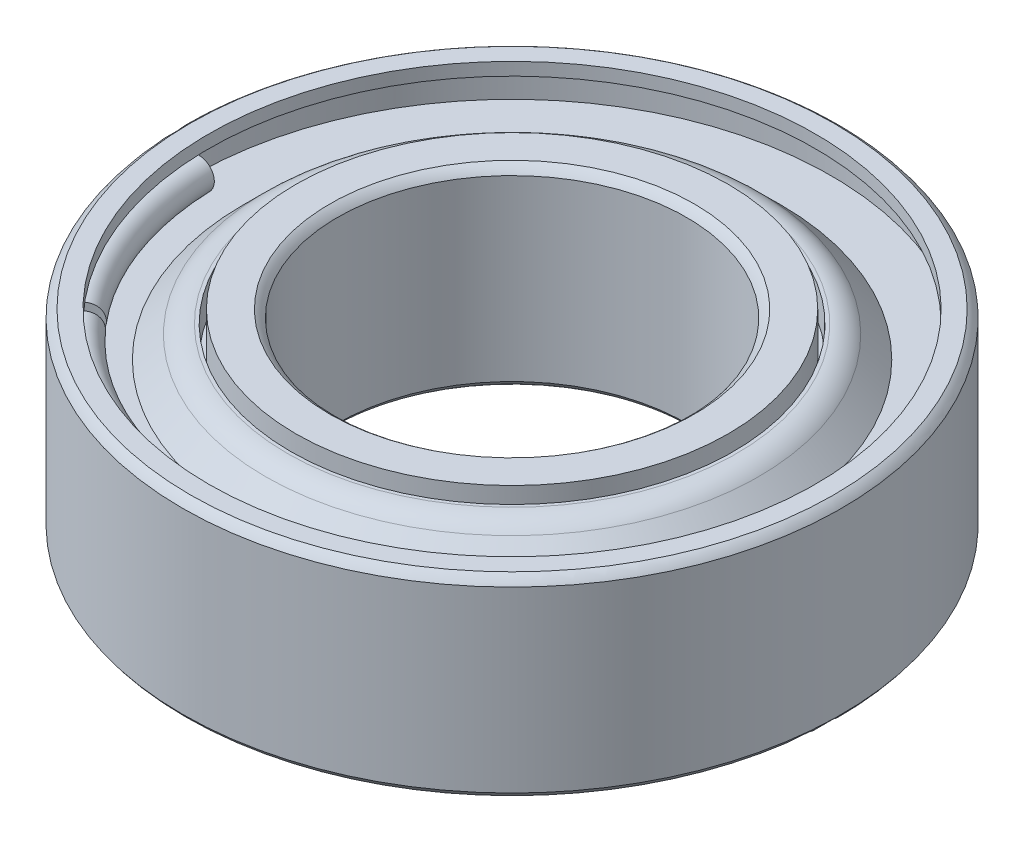
ISO-10303-21;
HEADER;
FILE_DESCRIPTION(('STEP AP214'),'2;1');
FILE_NAME('part.step','',(''),(''),'','','');
FILE_SCHEMA(('AUTOMOTIVE_DESIGN { 1 0 10303 214 1 1 1 1 }'));
ENDSEC;
DATA;
#1=APPLICATION_CONTEXT('core data for automotive mechanical design processes');
#2=APPLICATION_PROTOCOL_DEFINITION('international standard','automotive_design',2000,#1);
#3=PRODUCT_CONTEXT('',#1,'mechanical');
#4=PRODUCT('Part','Part','',(#3));
#5=PRODUCT_RELATED_PRODUCT_CATEGORY('part','',(#4));
#6=PRODUCT_DEFINITION_FORMATION('','',#4);
#7=PRODUCT_DEFINITION_CONTEXT('part definition',#1,'design');
#8=PRODUCT_DEFINITION('design','',#6,#7);
#9=PRODUCT_DEFINITION_SHAPE('','',#8);
#10=(LENGTH_UNIT() NAMED_UNIT(*) SI_UNIT(.MILLI.,.METRE.));
#11=(NAMED_UNIT(*) PLANE_ANGLE_UNIT() SI_UNIT($,.RADIAN.));
#12=(NAMED_UNIT(*) SI_UNIT($,.STERADIAN.) SOLID_ANGLE_UNIT());
#13=UNCERTAINTY_MEASURE_WITH_UNIT(LENGTH_MEASURE(1.E-05),#10,'distance_accuracy_value','');
#14=(GEOMETRIC_REPRESENTATION_CONTEXT(3) GLOBAL_UNCERTAINTY_ASSIGNED_CONTEXT((#13)) GLOBAL_UNIT_ASSIGNED_CONTEXT((#10,
#11,#12)) REPRESENTATION_CONTEXT('',''));
#15=CARTESIAN_POINT('',(0.,0.,0.));
#16=DIRECTION('',(0.,0.,1.));
#17=DIRECTION('',(1.,0.,0.));
#18=AXIS2_PLACEMENT_3D('',#15,#16,#17);
#19=CARTESIAN_POINT('',(0.,1.1302,0.));
#20=DIRECTION('',(0.,-1.,0.));
#21=DIRECTION('',(0.,0.,1.));
#22=AXIS2_PLACEMENT_3D('',#19,#20,#21);
#23=PLANE('',#22);
#24=CARTESIAN_POINT('',(0.,1.1302,0.));
#25=DIRECTION('',(0.,1.,0.));
#26=DIRECTION('',(0.,0.,1.));
#27=AXIS2_PLACEMENT_3D('',#24,#25,#26);
#28=CIRCLE('',#27,5.575);
#29=CARTESIAN_POINT('',(0.,1.1302,5.575));
#30=VERTEX_POINT('',#29);
#31=EDGE_CURVE('P0_E44',#30,#30,#28,.T.);
#32=ORIENTED_EDGE('',*,*,#31,.T.);
#33=EDGE_LOOP('',(#32));
#34=FACE_BOUND('',#33,.T.);
#35=CARTESIAN_POINT('',(0.,1.1302,0.));
#36=DIRECTION('',(0.,1.,0.));
#37=DIRECTION('',(0.,0.,1.));
#38=AXIS2_PLACEMENT_3D('',#35,#36,#37);
#39=CIRCLE('',#38,5.707692409183);
#40=CARTESIAN_POINT('',(0.,1.1302,5.707692409183));
#41=VERTEX_POINT('',#40);
#42=EDGE_CURVE('P0_E103',#41,#41,#39,.T.);
#43=ORIENTED_EDGE('',*,*,#42,.F.);
#44=EDGE_LOOP('',(#43));
#45=FACE_BOUND('',#44,.T.);
#46=ADVANCED_FACE('P0_F23',(#34,#45),#23,.T.);
#47=CARTESIAN_POINT('',(0.,3.8698,0.));
#48=DIRECTION('',(0.,1.,0.));
#49=DIRECTION('',(0.,0.,1.));
#50=AXIS2_PLACEMENT_3D('',#47,#48,#49);
#51=PLANE('',#50);
#52=CARTESIAN_POINT('',(0.,3.8698,0.));
#53=DIRECTION('',(0.,1.,0.));
#54=DIRECTION('',(0.,0.,1.));
#55=AXIS2_PLACEMENT_3D('',#52,#53,#54);
#56=CIRCLE('',#55,5.707692409183);
#57=CARTESIAN_POINT('',(0.,3.8698,5.707692409183));
#58=VERTEX_POINT('',#57);
#59=EDGE_CURVE('P0_E66',#58,#58,#56,.T.);
#60=ORIENTED_EDGE('',*,*,#59,.T.);
#61=EDGE_LOOP('',(#60));
#62=FACE_BOUND('',#61,.T.);
#63=CARTESIAN_POINT('',(0.,3.8698,0.));
#64=DIRECTION('',(0.,1.,0.));
#65=DIRECTION('',(0.,0.,1.));
#66=AXIS2_PLACEMENT_3D('',#63,#64,#65);
#67=CIRCLE('',#66,5.575);
#68=CARTESIAN_POINT('',(0.,3.8698,5.575));
#69=VERTEX_POINT('',#68);
#70=EDGE_CURVE('P0_E67',#69,#69,#67,.T.);
#71=ORIENTED_EDGE('',*,*,#70,.F.);
#72=EDGE_LOOP('',(#71));
#73=FACE_BOUND('',#72,.T.);
#74=ADVANCED_FACE('P0_F174',(#62,#73),#51,.T.);
#75=CARTESIAN_POINT('',(0.,1.1302,0.));
#76=DIRECTION('',(0.,1.,0.));
#77=DIRECTION('',(0.,0.,1.));
#78=AXIS2_PLACEMENT_3D('',#75,#76,#77);
#79=CIRCLE('',#78,6.925);
#80=CARTESIAN_POINT('',(0.,1.1302,6.925));
#81=VERTEX_POINT('',#80);
#82=EDGE_CURVE('P0_E124',#81,#81,#79,.T.);
#83=ORIENTED_EDGE('',*,*,#82,.T.);
#84=EDGE_LOOP('',(#83));
#85=FACE_BOUND('',#84,.T.);
#86=CARTESIAN_POINT('',(0.,1.1302,0.));
#87=DIRECTION('',(0.,1.,0.));
#88=DIRECTION('',(0.,0.,1.));
#89=AXIS2_PLACEMENT_3D('',#86,#87,#88);
#90=CIRCLE('',#89,8.225);
#91=CARTESIAN_POINT('',(0.,1.1302,8.225));
#92=VERTEX_POINT('',#91);
#93=EDGE_CURVE('P0_E54',#92,#92,#90,.T.);
#94=ORIENTED_EDGE('',*,*,#93,.F.);
#95=EDGE_LOOP('',(#94));
#96=FACE_BOUND('',#95,.T.);
#97=ADVANCED_FACE('P0_F176',(#85,#96),#23,.T.);
#98=CARTESIAN_POINT('',(0.,0.3302,0.));
#99=DIRECTION('',(0.,-1.,0.));
#100=DIRECTION('',(0.,0.,-1.));
#101=AXIS2_PLACEMENT_3D('',#98,#99,#100);
#102=PLANE('',#101);
#103=CARTESIAN_POINT('',(0.,0.3302,0.));
#104=DIRECTION('',(0.,1.,0.));
#105=DIRECTION('',(0.,0.,-1.));
#106=AXIS2_PLACEMENT_3D('',#103,#104,#105);
#107=CIRCLE('',#106,7.825);
#108=CARTESIAN_POINT('',(0.,0.3302,-7.825));
#109=VERTEX_POINT('',#108);
#110=EDGE_CURVE('P0_E55',#109,#109,#107,.T.);
#111=ORIENTED_EDGE('',*,*,#110,.F.);
#112=EDGE_LOOP('',(#111));
#113=FACE_BOUND('',#112,.T.);
#114=CARTESIAN_POINT('',(0.,0.3302,0.));
#115=DIRECTION('',(0.,1.,0.));
#116=DIRECTION('',(0.,0.,-1.));
#117=AXIS2_PLACEMENT_3D('',#114,#115,#116);
#118=CIRCLE('',#117,8.225);
#119=CARTESIAN_POINT('',(0.,0.3302,-8.225));
#120=VERTEX_POINT('',#119);
#121=EDGE_CURVE('P0_E50',#120,#120,#118,.T.);
#122=ORIENTED_EDGE('',*,*,#121,.T.);
#123=EDGE_LOOP('',(#122));
#124=FACE_BOUND('',#123,.T.);
#125=ADVANCED_FACE('P0_F186',(#113,#124),#102,.F.);
#126=CARTESIAN_POINT('',(0.,3.8698,0.));
#127=DIRECTION('',(0.,1.,0.));
#128=DIRECTION('',(0.,0.,1.));
#129=AXIS2_PLACEMENT_3D('',#126,#127,#128);
#130=CIRCLE('',#129,8.225);
#131=CARTESIAN_POINT('',(0.,3.8698,8.225));
#132=VERTEX_POINT('',#131);
#133=EDGE_CURVE('P0_E45',#132,#132,#130,.T.);
#134=ORIENTED_EDGE('',*,*,#133,.T.);
#135=EDGE_LOOP('',(#134));
#136=FACE_BOUND('',#135,.T.);
#137=CARTESIAN_POINT('',(0.,3.8698,0.));
#138=DIRECTION('',(0.,1.,0.));
#139=DIRECTION('',(0.,0.,1.));
#140=AXIS2_PLACEMENT_3D('',#137,#138,#139);
#141=CIRCLE('',#140,6.925);
#142=CARTESIAN_POINT('',(0.,3.8698,6.925));
#143=VERTEX_POINT('',#142);
#144=EDGE_CURVE('P0_E115',#143,#143,#141,.T.);
#145=ORIENTED_EDGE('',*,*,#144,.F.);
#146=EDGE_LOOP('',(#145));
#147=FACE_BOUND('',#146,.T.);
#148=ADVANCED_FACE('P0_F182',(#136,#147),#51,.T.);
#149=CARTESIAN_POINT('',(0.,4.6698,0.));
#150=DIRECTION('',(0.,1.,0.));
#151=DIRECTION('',(0.,0.,1.));
#152=AXIS2_PLACEMENT_3D('',#149,#150,#151);
#153=PLANE('',#152);
#154=CARTESIAN_POINT('',(0.,4.6698,0.));
#155=DIRECTION('',(0.,-1.,0.));
#156=DIRECTION('',(0.,0.,1.));
#157=AXIS2_PLACEMENT_3D('',#154,#155,#156);
#158=CIRCLE('',#157,7.825);
#159=CARTESIAN_POINT('',(0.,4.6698,7.825));
#160=VERTEX_POINT('',#159);
#161=EDGE_CURVE('P0_E32',#160,#160,#158,.T.);
#162=ORIENTED_EDGE('',*,*,#161,.F.);
#163=EDGE_LOOP('',(#162));
#164=FACE_BOUND('',#163,.T.);
#165=CARTESIAN_POINT('',(0.,4.6698,0.));
#166=DIRECTION('',(0.,1.,0.));
#167=DIRECTION('',(0.,0.,1.));
#168=AXIS2_PLACEMENT_3D('',#165,#166,#167);
#169=CIRCLE('',#168,8.225);
#170=CARTESIAN_POINT('',(0.,4.6698,8.225));
#171=VERTEX_POINT('',#170);
#172=EDGE_CURVE('P0_E41',#171,#171,#169,.T.);
#173=ORIENTED_EDGE('',*,*,#172,.F.);
#174=EDGE_LOOP('',(#173));
#175=FACE_BOUND('',#174,.T.);
#176=ADVANCED_FACE('P0_F478',(#164,#175),#153,.F.);
#177=CARTESIAN_POINT('',(0.,4.6698,0.));
#178=DIRECTION('',(0.,1.,0.));
#179=DIRECTION('',(0.,0.,1.));
#180=AXIS2_PLACEMENT_3D('',#177,#178,#179);
#181=CIRCLE('',#180,5.79362915010153);
#182=CARTESIAN_POINT('',(0.,4.6698,5.79362915010153));
#183=VERTEX_POINT('',#182);
#184=EDGE_CURVE('P0_E111',#183,#183,#181,.T.);
#185=ORIENTED_EDGE('',*,*,#184,.T.);
#186=EDGE_LOOP('',(#185));
#187=FACE_BOUND('',#186,.T.);
#188=CARTESIAN_POINT('',(0.,4.6698,0.));
#189=DIRECTION('',(0.,1.,0.));
#190=DIRECTION('',(0.,0.,1.));
#191=AXIS2_PLACEMENT_3D('',#188,#189,#190);
#192=CIRCLE('',#191,5.707692409183);
#193=CARTESIAN_POINT('',(0.,4.6698,5.707692409183));
#194=VERTEX_POINT('',#193);
#195=EDGE_CURVE('P0_E61',#194,#194,#192,.T.);
#196=ORIENTED_EDGE('',*,*,#195,.F.);
#197=EDGE_LOOP('',(#196));
#198=FACE_BOUND('',#197,.T.);
#199=ADVANCED_FACE('P0_F468',(#187,#198),#153,.T.);
#200=CARTESIAN_POINT('',(0.,0.3302,0.));
#201=DIRECTION('',(0.,1.,0.));
#202=DIRECTION('',(0.,0.,1.));
#203=AXIS2_PLACEMENT_3D('',#200,#201,#202);
#204=CIRCLE('',#203,5.707692409183);
#205=CARTESIAN_POINT('',(0.,0.3302,5.707692409183));
#206=VERTEX_POINT('',#205);
#207=EDGE_CURVE('P0_E74',#206,#206,#204,.T.);
#208=ORIENTED_EDGE('',*,*,#207,.T.);
#209=EDGE_LOOP('',(#208));
#210=FACE_BOUND('',#209,.T.);
#211=CARTESIAN_POINT('',(0.,0.3302,0.));
#212=DIRECTION('',(0.,-1.,0.));
#213=DIRECTION('',(0.,0.,-1.));
#214=AXIS2_PLACEMENT_3D('',#211,#212,#213);
#215=CIRCLE('',#214,5.79362915010152);
#216=CARTESIAN_POINT('',(0.,0.3302,-5.79362915010152));
#217=VERTEX_POINT('',#216);
#218=EDGE_CURVE('P0_E120',#217,#217,#215,.T.);
#219=ORIENTED_EDGE('',*,*,#218,.T.);
#220=EDGE_LOOP('',(#219));
#221=FACE_BOUND('',#220,.T.);
#222=ADVANCED_FACE('P0_F193',(#210,#221),#102,.T.);
#223=CARTESIAN_POINT('',(0.,5.,0.));
#224=DIRECTION('',(0.,1.,0.));
#225=DIRECTION('',(0.,0.,1.));
#226=AXIS2_PLACEMENT_3D('',#223,#224,#225);
#227=PLANE('',#226);
#228=CARTESIAN_POINT('',(0.,5.,0.));
#229=DIRECTION('',(0.,1.,0.));
#230=DIRECTION('',(0.,0.,1.));
#231=AXIS2_PLACEMENT_3D('',#228,#229,#230);
#232=CIRCLE('',#231,8.3);
#233=CARTESIAN_POINT('',(0.,5.,8.3));
#234=VERTEX_POINT('',#233);
#235=EDGE_CURVE('P0_E107',#234,#234,#232,.T.);
#236=ORIENTED_EDGE('',*,*,#235,.T.);
#237=EDGE_LOOP('',(#236));
#238=FACE_BOUND('',#237,.T.);
#239=CARTESIAN_POINT('',(0.,5.,0.));
#240=DIRECTION('',(0.,1.,0.));
#241=DIRECTION('',(0.,0.,1.));
#242=AXIS2_PLACEMENT_3D('',#239,#240,#241);
#243=CIRCLE('',#242,7.825);
#244=CARTESIAN_POINT('',(0.,5.,7.825));
#245=VERTEX_POINT('',#244);
#246=EDGE_CURVE('P0_E12',#245,#245,#243,.T.);
#247=ORIENTED_EDGE('',*,*,#246,.F.);
#248=EDGE_LOOP('',(#247));
#249=FACE_BOUND('',#248,.T.);
#250=ADVANCED_FACE('P0_F248',(#238,#249),#227,.T.);
#251=CARTESIAN_POINT('',(0.,0.,0.));
#252=DIRECTION('',(0.,1.,0.));
#253=DIRECTION('',(0.,0.,1.));
#254=AXIS2_PLACEMENT_3D('',#251,#252,#253);
#255=PLANE('',#254);
#256=CARTESIAN_POINT('',(0.,0.,0.));
#257=DIRECTION('',(0.,1.,0.));
#258=DIRECTION('',(0.,0.,1.));
#259=AXIS2_PLACEMENT_3D('',#256,#257,#258);
#260=CIRCLE('',#259,8.3);
#261=CARTESIAN_POINT('',(0.,0.,8.3));
#262=VERTEX_POINT('',#261);
#263=EDGE_CURVE('P0_E92',#262,#262,#260,.T.);
#264=ORIENTED_EDGE('',*,*,#263,.F.);
#265=EDGE_LOOP('',(#264));
#266=FACE_BOUND('',#265,.T.);
#267=CARTESIAN_POINT('',(0.,0.,0.));
#268=DIRECTION('',(0.,-1.,0.));
#269=DIRECTION('',(0.,0.,-1.));
#270=AXIS2_PLACEMENT_3D('',#267,#268,#269);
#271=CIRCLE('',#270,7.825);
#272=CARTESIAN_POINT('',(0.,0.,-7.825));
#273=VERTEX_POINT('',#272);
#274=EDGE_CURVE('P0_E59',#273,#273,#271,.T.);
#275=ORIENTED_EDGE('',*,*,#274,.F.);
#276=EDGE_LOOP('',(#275));
#277=FACE_BOUND('',#276,.T.);
#278=ADVANCED_FACE('P0_F239',(#266,#277),#255,.F.);
#279=CARTESIAN_POINT('',(0.,5.,0.));
#280=DIRECTION('',(0.,1.,0.));
#281=DIRECTION('',(0.,0.,1.));
#282=AXIS2_PLACEMENT_3D('',#279,#280,#281);
#283=CIRCLE('',#282,4.7);
#284=CARTESIAN_POINT('',(0.,5.,4.7));
#285=VERTEX_POINT('',#284);
#286=EDGE_CURVE('P0_E79',#285,#285,#283,.T.);
#287=ORIENTED_EDGE('',*,*,#286,.F.);
#288=EDGE_LOOP('',(#287));
#289=FACE_BOUND('',#288,.T.);
#290=CARTESIAN_POINT('',(0.,5.,0.));
#291=DIRECTION('',(0.,1.,0.));
#292=DIRECTION('',(0.,0.,1.));
#293=AXIS2_PLACEMENT_3D('',#290,#291,#292);
#294=CIRCLE('',#293,5.575);
#295=CARTESIAN_POINT('',(0.,5.,5.575));
#296=VERTEX_POINT('',#295);
#297=EDGE_CURVE('P0_E27',#296,#296,#294,.T.);
#298=ORIENTED_EDGE('',*,*,#297,.T.);
#299=EDGE_LOOP('',(#298));
#300=FACE_BOUND('',#299,.T.);
#301=ADVANCED_FACE('P0_F236',(#289,#300),#227,.T.);
#302=CARTESIAN_POINT('',(0.,0.,0.));
#303=DIRECTION('',(0.,1.,0.));
#304=DIRECTION('',(0.,0.,1.));
#305=AXIS2_PLACEMENT_3D('',#302,#303,#304);
#306=CIRCLE('',#305,4.7);
#307=CARTESIAN_POINT('',(0.,0.,4.7));
#308=VERTEX_POINT('',#307);
#309=EDGE_CURVE('P0_E80',#308,#308,#306,.T.);
#310=ORIENTED_EDGE('',*,*,#309,.T.);
#311=EDGE_LOOP('',(#310));
#312=FACE_BOUND('',#311,.T.);
#313=CARTESIAN_POINT('',(0.,0.,0.));
#314=DIRECTION('',(0.,-1.,0.));
#315=DIRECTION('',(0.,0.,-1.));
#316=AXIS2_PLACEMENT_3D('',#313,#314,#315);
#317=CIRCLE('',#316,5.575);
#318=CARTESIAN_POINT('',(0.,0.,-5.575));
#319=VERTEX_POINT('',#318);
#320=EDGE_CURVE('P0_E60',#319,#319,#317,.T.);
#321=ORIENTED_EDGE('',*,*,#320,.T.);
#322=EDGE_LOOP('',(#321));
#323=FACE_BOUND('',#322,.T.);
#324=ADVANCED_FACE('P0_F233',(#312,#323),#255,.F.);
#325=CARTESIAN_POINT('',(0.,0.,0.));
#326=DIRECTION('',(0.,1.,0.));
#327=DIRECTION('',(0.,0.,1.));
#328=AXIS2_PLACEMENT_3D('',#325,#326,#327);
#329=CYLINDRICAL_SURFACE('',#328,4.5);
#330=CARTESIAN_POINT('',(0.,4.8,0.));
#331=DIRECTION('',(0.,1.,0.));
#332=DIRECTION('',(0.,0.,1.));
#333=AXIS2_PLACEMENT_3D('',#330,#331,#332);
#334=CIRCLE('',#333,4.5);
#335=CARTESIAN_POINT('',(0.,4.8,4.5));
#336=VERTEX_POINT('',#335);
#337=EDGE_CURVE('P0_E84',#336,#336,#334,.T.);
#338=ORIENTED_EDGE('',*,*,#337,.T.);
#339=EDGE_LOOP('',(#338));
#340=FACE_BOUND('',#339,.T.);
#341=CARTESIAN_POINT('',(0.,0.200000000000003,0.));
#342=DIRECTION('',(0.,1.,0.));
#343=DIRECTION('',(0.,0.,1.));
#344=AXIS2_PLACEMENT_3D('',#341,#342,#343);
#345=CIRCLE('',#344,4.5);
#346=CARTESIAN_POINT('',(0.,0.200000000000003,4.5));
#347=VERTEX_POINT('',#346);
#348=EDGE_CURVE('P0_E75',#347,#347,#345,.T.);
#349=ORIENTED_EDGE('',*,*,#348,.F.);
#350=EDGE_LOOP('',(#349));
#351=FACE_BOUND('',#350,.T.);
#352=ADVANCED_FACE('P0_F235',(#340,#351),#329,.F.);
#353=CARTESIAN_POINT('',(0.,5.,0.));
#354=DIRECTION('',(0.,-1.,0.));
#355=DIRECTION('',(0.,0.,-1.));
#356=AXIS2_PLACEMENT_3D('',#353,#354,#355);
#357=CYLINDRICAL_SURFACE('',#356,8.5);
#358=CARTESIAN_POINT('',(0.,0.200000000000003,0.));
#359=DIRECTION('',(0.,1.,0.));
#360=DIRECTION('',(0.,0.,1.));
#361=AXIS2_PLACEMENT_3D('',#358,#359,#360);
#362=CIRCLE('',#361,8.5);
#363=CARTESIAN_POINT('',(0.,0.200000000000003,8.5));
#364=VERTEX_POINT('',#363);
#365=EDGE_CURVE('P0_E88',#364,#364,#362,.T.);
#366=ORIENTED_EDGE('',*,*,#365,.T.);
#367=EDGE_LOOP('',(#366));
#368=FACE_BOUND('',#367,.T.);
#369=CARTESIAN_POINT('',(0.,4.8,0.));
#370=DIRECTION('',(0.,1.,0.));
#371=DIRECTION('',(0.,0.,1.));
#372=AXIS2_PLACEMENT_3D('',#369,#370,#371);
#373=CIRCLE('',#372,8.5);
#374=CARTESIAN_POINT('',(0.,4.8,8.5));
#375=VERTEX_POINT('',#374);
#376=EDGE_CURVE('P0_E96',#375,#375,#373,.T.);
#377=ORIENTED_EDGE('',*,*,#376,.F.);
#378=EDGE_LOOP('',(#377));
#379=FACE_BOUND('',#378,.T.);
#380=ADVANCED_FACE('P0_F222',(#368,#379),#357,.T.);
#381=CARTESIAN_POINT('',(0.,0.3302,0.));
#382=DIRECTION('',(0.,-1.,0.));
#383=DIRECTION('',(0.,0.,-1.));
#384=AXIS2_PLACEMENT_3D('',#381,#382,#383);
#385=CYLINDRICAL_SURFACE('',#384,7.825);
#386=ORIENTED_EDGE('',*,*,#246,.T.);
#387=EDGE_LOOP('',(#386));
#388=FACE_BOUND('',#387,.T.);
#389=ORIENTED_EDGE('',*,*,#161,.T.);
#390=EDGE_LOOP('',(#389));
#391=FACE_BOUND('',#390,.T.);
#392=ADVANCED_FACE('P0_F25',(#388,#391),#385,.F.);
#393=CARTESIAN_POINT('',(0.,0.3302,0.));
#394=DIRECTION('',(0.,-1.,0.));
#395=DIRECTION('',(0.,0.,-1.));
#396=AXIS2_PLACEMENT_3D('',#393,#394,#395);
#397=CYLINDRICAL_SURFACE('',#396,5.575);
#398=ORIENTED_EDGE('',*,*,#297,.F.);
#399=EDGE_LOOP('',(#398));
#400=FACE_BOUND('',#399,.T.);
#401=ORIENTED_EDGE('',*,*,#70,.T.);
#402=EDGE_LOOP('',(#401));
#403=FACE_BOUND('',#402,.T.);
#404=ADVANCED_FACE('P0_F213',(#400,#403),#397,.T.);
#405=ORIENTED_EDGE('',*,*,#274,.T.);
#406=EDGE_LOOP('',(#405));
#407=FACE_BOUND('',#406,.T.);
#408=ORIENTED_EDGE('',*,*,#110,.T.);
#409=EDGE_LOOP('',(#408));
#410=FACE_BOUND('',#409,.T.);
#411=ADVANCED_FACE('P0_F215',(#407,#410),#385,.F.);
#412=ORIENTED_EDGE('',*,*,#320,.F.);
#413=EDGE_LOOP('',(#412));
#414=FACE_BOUND('',#413,.T.);
#415=ORIENTED_EDGE('',*,*,#31,.F.);
#416=EDGE_LOOP('',(#415));
#417=FACE_BOUND('',#416,.T.);
#418=ADVANCED_FACE('P0_F209',(#414,#417),#397,.T.);
#419=CARTESIAN_POINT('',(0.,1.1302,0.));
#420=DIRECTION('',(0.,-1.,0.));
#421=DIRECTION('',(0.,0.,-1.));
#422=AXIS2_PLACEMENT_3D('',#419,#420,#421);
#423=CYLINDRICAL_SURFACE('',#422,8.225);
#424=ORIENTED_EDGE('',*,*,#172,.T.);
#425=EDGE_LOOP('',(#424));
#426=FACE_BOUND('',#425,.T.);
#427=ORIENTED_EDGE('',*,*,#133,.F.);
#428=EDGE_LOOP('',(#427));
#429=FACE_BOUND('',#428,.T.);
#430=ADVANCED_FACE('P0_F200',(#426,#429),#423,.F.);
#431=ORIENTED_EDGE('',*,*,#121,.F.);
#432=EDGE_LOOP('',(#431));
#433=FACE_BOUND('',#432,.T.);
#434=ORIENTED_EDGE('',*,*,#93,.T.);
#435=EDGE_LOOP('',(#434));
#436=FACE_BOUND('',#435,.T.);
#437=ADVANCED_FACE('P0_F198',(#433,#436),#423,.F.);
#438=CARTESIAN_POINT('',(0.,1.1302,0.));
#439=DIRECTION('',(0.,1.,0.));
#440=DIRECTION('',(0.,0.,1.));
#441=AXIS2_PLACEMENT_3D('',#438,#439,#440);
#442=CONICAL_SURFACE('',#441,6.925,0.78539816339745);
#443=ORIENTED_EDGE('',*,*,#82,.F.);
#444=EDGE_LOOP('',(#443));
#445=FACE_BOUND('',#444,.T.);
#446=CARTESIAN_POINT('',(0.,0.564514575050762,0.));
#447=DIRECTION('',(0.,1.,0.));
#448=DIRECTION('',(0.,0.,-1.));
#449=AXIS2_PLACEMENT_3D('',#446,#447,#448);
#450=CIRCLE('',#449,6.35931457505075);
#451=CARTESIAN_POINT('',(0.,0.564514575050762,-6.35931457505075));
#452=VERTEX_POINT('',#451);
#453=EDGE_CURVE('P0_E65',#452,#452,#450,.T.);
#454=ORIENTED_EDGE('',*,*,#453,.T.);
#455=EDGE_LOOP('',(#454));
#456=FACE_BOUND('',#455,.T.);
#457=ADVANCED_FACE('P0_F151',(#445,#456),#442,.T.);
#458=CARTESIAN_POINT('',(0.,4.6698,0.));
#459=DIRECTION('',(0.,-1.,0.));
#460=DIRECTION('',(0.,0.,-1.));
#461=AXIS2_PLACEMENT_3D('',#458,#459,#460);
#462=CONICAL_SURFACE('',#461,6.125,0.785398163397446);
#463=ORIENTED_EDGE('',*,*,#144,.T.);
#464=EDGE_LOOP('',(#463));
#465=FACE_BOUND('',#464,.T.);
#466=CARTESIAN_POINT('',(0.,4.43548542494923,0.));
#467=DIRECTION('',(0.,-1.,0.));
#468=DIRECTION('',(0.,0.,1.));
#469=AXIS2_PLACEMENT_3D('',#466,#467,#468);
#470=CIRCLE('',#469,6.35931457505077);
#471=CARTESIAN_POINT('',(0.,4.43548542494923,6.35931457505077));
#472=VERTEX_POINT('',#471);
#473=EDGE_CURVE('P0_E116',#472,#472,#470,.T.);
#474=ORIENTED_EDGE('',*,*,#473,.T.);
#475=EDGE_LOOP('',(#474));
#476=FACE_BOUND('',#475,.T.);
#477=ADVANCED_FACE('P0_F167',(#465,#476),#462,.T.);
#478=CARTESIAN_POINT('',(0.,3.8698,0.));
#479=DIRECTION('',(0.,1.,0.));
#480=DIRECTION('',(0.,0.,1.));
#481=AXIS2_PLACEMENT_3D('',#478,#479,#480);
#482=TOROIDAL_SURFACE('',#481,5.79362915010153,0.8);
#483=ORIENTED_EDGE('',*,*,#184,.F.);
#484=EDGE_LOOP('',(#483));
#485=FACE_BOUND('',#484,.T.);
#486=ORIENTED_EDGE('',*,*,#473,.F.);
#487=EDGE_LOOP('',(#486));
#488=FACE_BOUND('',#487,.T.);
#489=ADVANCED_FACE('P0_F156',(#485,#488),#482,.T.);
#490=CARTESIAN_POINT('',(0.,1.1302,0.));
#491=DIRECTION('',(0.,-1.,0.));
#492=DIRECTION('',(0.,0.,-1.));
#493=AXIS2_PLACEMENT_3D('',#490,#491,#492);
#494=TOROIDAL_SURFACE('',#493,5.79362915010152,0.8);
#495=ORIENTED_EDGE('',*,*,#218,.F.);
#496=EDGE_LOOP('',(#495));
#497=FACE_BOUND('',#496,.T.);
#498=ORIENTED_EDGE('',*,*,#453,.F.);
#499=EDGE_LOOP('',(#498));
#500=FACE_BOUND('',#499,.T.);
#501=ADVANCED_FACE('P0_F153',(#497,#500),#494,.T.);
#502=CARTESIAN_POINT('',(0.,1.1302,0.));
#503=DIRECTION('',(0.,-1.,0.));
#504=DIRECTION('',(0.,0.,-1.));
#505=AXIS2_PLACEMENT_3D('',#502,#503,#504);
#506=CYLINDRICAL_SURFACE('',#505,5.707692409183);
#507=ORIENTED_EDGE('',*,*,#195,.T.);
#508=EDGE_LOOP('',(#507));
#509=FACE_BOUND('',#508,.T.);
#510=ORIENTED_EDGE('',*,*,#59,.F.);
#511=EDGE_LOOP('',(#510));
#512=FACE_BOUND('',#511,.T.);
#513=ADVANCED_FACE('P0_F155',(#509,#512),#506,.F.);
#514=ORIENTED_EDGE('',*,*,#207,.F.);
#515=EDGE_LOOP('',(#514));
#516=FACE_BOUND('',#515,.T.);
#517=ORIENTED_EDGE('',*,*,#42,.T.);
#518=EDGE_LOOP('',(#517));
#519=FACE_BOUND('',#518,.T.);
#520=ADVANCED_FACE('P0_F164',(#516,#519),#506,.F.);
#521=CARTESIAN_POINT('',(0.,4.43306454914443,0.));
#522=DIRECTION('',(0.,1.,0.));
#523=DIRECTION('',(0.,0.,1.));
#524=AXIS2_PLACEMENT_3D('',#521,#522,#523);
#525=TOROIDAL_SURFACE('',#524,7.93306454914443,0.675320242945071);
#526=ORIENTED_EDGE('',*,*,#235,.F.);
#527=EDGE_LOOP('',(#526));
#528=FACE_BOUND('',#527,.T.);
#529=ORIENTED_EDGE('',*,*,#376,.T.);
#530=EDGE_LOOP('',(#529));
#531=FACE_BOUND('',#530,.T.);
#532=ADVANCED_FACE('P0_F266',(#528,#531),#525,.T.);
#533=CARTESIAN_POINT('',(0.,0.566935450855571,0.));
#534=DIRECTION('',(0.,-1.,0.));
#535=DIRECTION('',(0.,0.,1.));
#536=AXIS2_PLACEMENT_3D('',#533,#534,#535);
#537=TOROIDAL_SURFACE('',#536,7.93306454914443,0.675320242945071);
#538=ORIENTED_EDGE('',*,*,#263,.T.);
#539=EDGE_LOOP('',(#538));
#540=FACE_BOUND('',#539,.T.);
#541=ORIENTED_EDGE('',*,*,#365,.F.);
#542=EDGE_LOOP('',(#541));
#543=FACE_BOUND('',#542,.T.);
#544=ADVANCED_FACE('P0_F262',(#540,#543),#537,.T.);
#545=CARTESIAN_POINT('',(0.,4.43306454914443,0.));
#546=DIRECTION('',(0.,1.,0.));
#547=DIRECTION('',(0.,0.,1.));
#548=AXIS2_PLACEMENT_3D('',#545,#546,#547);
#549=TOROIDAL_SURFACE('',#548,5.06693545085557,0.67532024294507);
#550=ORIENTED_EDGE('',*,*,#337,.F.);
#551=EDGE_LOOP('',(#550));
#552=FACE_BOUND('',#551,.T.);
#553=ORIENTED_EDGE('',*,*,#286,.T.);
#554=EDGE_LOOP('',(#553));
#555=FACE_BOUND('',#554,.T.);
#556=ADVANCED_FACE('P0_F265',(#552,#555),#549,.T.);
#557=CARTESIAN_POINT('',(0.,0.566935450855571,0.));
#558=DIRECTION('',(0.,-1.,0.));
#559=DIRECTION('',(0.,0.,1.));
#560=AXIS2_PLACEMENT_3D('',#557,#558,#559);
#561=TOROIDAL_SURFACE('',#560,5.06693545085557,0.67532024294507);
#562=ORIENTED_EDGE('',*,*,#348,.T.);
#563=EDGE_LOOP('',(#562));
#564=FACE_BOUND('',#563,.T.);
#565=ORIENTED_EDGE('',*,*,#309,.F.);
#566=EDGE_LOOP('',(#565));
#567=FACE_BOUND('',#566,.T.);
#568=ADVANCED_FACE('P0_F284',(#564,#567),#561,.T.);
#569=CLOSED_SHELL('',(#46,#74,#97,#125,#148,#176,#199,#222,#250,#278,#301,#324,#352,#380,#392,
#404,#411,#418,#430,#437,#457,#477,#489,#501,#513,#520,#532,#544,#556,#568));
#570=MANIFOLD_SOLID_BREP('P0_B1',#569);
#571=CARTESIAN_POINT('',(0.,0.,0.));
#572=DIRECTION('',(0.984807753012209,0.,0.173648177666928));
#573=DIRECTION('',(0.173648177666928,0.,-0.984807753012209));
#574=AXIS2_PLACEMENT_3D('',#571,#572,#573);
#575=PLANE('',#574);
#576=CARTESIAN_POINT('',(-1.35879699024371,4.2698,7.70612066732053));
#577=DIRECTION('',(0.984807753012209,0.,0.173648177666928));
#578=DIRECTION('',(0.173648177666928,0.,-0.984807753012209));
#579=AXIS2_PLACEMENT_3D('',#576,#577,#578);
#580=CIRCLE('',#579,0.4);
#581=CARTESIAN_POINT('',(-1.42825626131048,4.2698,8.10004376852542));
#582=VERTEX_POINT('',#581);
#583=EDGE_CURVE('P1_E10',#582,#582,#580,.T.);
#584=ORIENTED_EDGE('',*,*,#583,.T.);
#585=EDGE_LOOP('',(#584));
#586=FACE_BOUND('',#585,.T.);
#587=ADVANCED_FACE('P1_F15',(#586),#575,.T.);
#588=CARTESIAN_POINT('',(0.,0.,0.));
#589=DIRECTION('',(0.66913060635886,0.,0.743144825477393));
#590=DIRECTION('',(0.743144825477393,0.,-0.66913060635886));
#591=AXIS2_PLACEMENT_3D('',#588,#589,#590);
#592=PLANE('',#591);
#593=CARTESIAN_POINT('',(-5.8151082593606,4.2698,5.23594699475807));
#594=DIRECTION('',(0.66913060635886,0.,0.743144825477393));
#595=DIRECTION('',(0.743144825477393,0.,-0.66913060635886));
#596=AXIS2_PLACEMENT_3D('',#593,#594,#595);
#597=CIRCLE('',#596,0.4);
#598=CARTESIAN_POINT('',(-6.11236618955156,4.2698,5.50359923730162));
#599=VERTEX_POINT('',#598);
#600=EDGE_CURVE('P1_E22',#599,#599,#597,.T.);
#601=ORIENTED_EDGE('',*,*,#600,.F.);
#602=EDGE_LOOP('',(#601));
#603=FACE_BOUND('',#602,.T.);
#604=ADVANCED_FACE('P1_F35',(#603),#592,.F.);
#605=CARTESIAN_POINT('',(0.,4.2698,0.));
#606=DIRECTION('',(0.,1.,0.));
#607=DIRECTION('',(0.984807753012209,0.,0.173648177666928));
#608=AXIS2_PLACEMENT_3D('',#605,#606,#607);
#609=TOROIDAL_SURFACE('',#608,7.825,0.4);
#610=CARTESIAN_POINT('',(0.,4.2698,0.));
#611=DIRECTION('',(0.,1.,0.));
#612=DIRECTION('',(0.984807753012209,0.,0.173648177666928));
#613=AXIS2_PLACEMENT_3D('',#610,#611,#612);
#614=CIRCLE('',#613,8.225);
#615=EDGE_CURVE('',#599,#582,#614,.T.);
#616=ORIENTED_EDGE('',*,*,#600,.T.);
#617=ORIENTED_EDGE('',*,*,#583,.F.);
#618=ORIENTED_EDGE('',*,*,#615,.T.);
#619=ORIENTED_EDGE('',*,*,#615,.F.);
#620=EDGE_LOOP('',(#616,#618,#617,#619));
#621=FACE_BOUND('',#620,.T.);
#622=ADVANCED_FACE('P1_F33',(#621),#609,.T.);
#623=CLOSED_SHELL('',(#587,#604,#622));
#624=MANIFOLD_SOLID_BREP('P1_B1',#623);
#625=CARTESIAN_POINT('',(0.,0.,0.));
#626=DIRECTION('',(0.642787609686541,0.,0.766044443118977));
#627=DIRECTION('',(0.766044443118977,0.,-0.642787609686541));
#628=AXIS2_PLACEMENT_3D('',#625,#626,#627);
#629=PLANE('',#628);
#630=CARTESIAN_POINT('',(-5.994297767406,4.2698,5.02981304579718));
#631=DIRECTION('',(0.642787609686541,0.,0.766044443118977));
#632=DIRECTION('',(0.766044443118977,0.,-0.642787609686541));
#633=AXIS2_PLACEMENT_3D('',#630,#631,#632);
#634=CIRCLE('',#633,0.4);
#635=CARTESIAN_POINT('',(-6.30071554465359,4.2698,5.28692808967179));
#636=VERTEX_POINT('',#635);
#637=EDGE_CURVE('P2_E10',#636,#636,#634,.T.);
#638=ORIENTED_EDGE('',*,*,#637,.T.);
#639=EDGE_LOOP('',(#638));
#640=FACE_BOUND('',#639,.T.);
#641=ADVANCED_FACE('P2_F15',(#640),#629,.T.);
#642=CARTESIAN_POINT('',(0.,0.,0.));
#643=DIRECTION('',(0.0348994967025009,0.,0.999390827019096));
#644=DIRECTION('',(0.999390827019096,0.,-0.0348994967025009));
#645=AXIS2_PLACEMENT_3D('',#642,#643,#644);
#646=PLANE('',#645);
#647=CARTESIAN_POINT('',(-7.82023322142443,4.2698,0.27308856169707));
#648=DIRECTION('',(0.0348994967025009,0.,0.999390827019096));
#649=DIRECTION('',(0.999390827019096,0.,-0.034899496702501));
#650=AXIS2_PLACEMENT_3D('',#647,#648,#649);
#651=CIRCLE('',#650,0.4);
#652=CARTESIAN_POINT('',(-8.21998955223206,4.2698,0.287048360378071));
#653=VERTEX_POINT('',#652);
#654=EDGE_CURVE('P2_E22',#653,#653,#651,.T.);
#655=ORIENTED_EDGE('',*,*,#654,.F.);
#656=EDGE_LOOP('',(#655));
#657=FACE_BOUND('',#656,.T.);
#658=ADVANCED_FACE('P2_F35',(#657),#646,.F.);
#659=CARTESIAN_POINT('',(0.,4.2698,0.));
#660=DIRECTION('',(0.,1.,0.));
#661=DIRECTION('',(0.642787609686541,0.,0.766044443118977));
#662=AXIS2_PLACEMENT_3D('',#659,#660,#661);
#663=TOROIDAL_SURFACE('',#662,7.825,0.4);
#664=CARTESIAN_POINT('',(0.,4.2698,0.));
#665=DIRECTION('',(0.,1.,0.));
#666=DIRECTION('',(0.642787609686541,0.,0.766044443118977));
#667=AXIS2_PLACEMENT_3D('',#664,#665,#666);
#668=CIRCLE('',#667,8.225);
#669=EDGE_CURVE('',#653,#636,#668,.T.);
#670=ORIENTED_EDGE('',*,*,#654,.T.);
#671=ORIENTED_EDGE('',*,*,#637,.F.);
#672=ORIENTED_EDGE('',*,*,#669,.T.);
#673=ORIENTED_EDGE('',*,*,#669,.F.);
#674=EDGE_LOOP('',(#670,#672,#671,#673));
#675=FACE_BOUND('',#674,.T.);
#676=ADVANCED_FACE('P2_F33',(#675),#663,.T.);
#677=CLOSED_SHELL('',(#641,#658,#676));
#678=MANIFOLD_SOLID_BREP('P2_B1',#677);
#679=ADVANCED_BREP_SHAPE_REPRESENTATION('',(#18,#570,#624,#678),#14);
#680=SHAPE_DEFINITION_REPRESENTATION(#9,#679);
ENDSEC;
END-ISO-10303-21;
